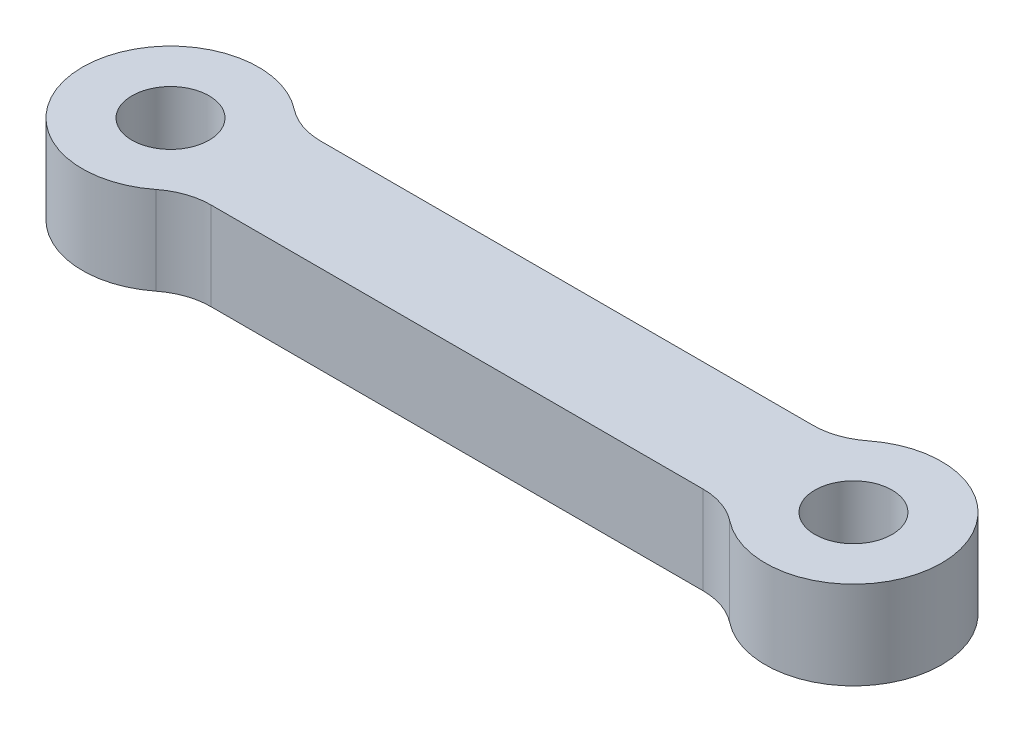
ISO-10303-21;
HEADER;
FILE_DESCRIPTION(('STEP AP214'),'2;1');
FILE_NAME('part.step','',(''),(''),'','','');
FILE_SCHEMA(('AUTOMOTIVE_DESIGN { 1 0 10303 214 1 1 1 1 }'));
ENDSEC;
DATA;
#1=APPLICATION_CONTEXT('core data for automotive mechanical design processes');
#2=APPLICATION_PROTOCOL_DEFINITION('international standard','automotive_design',2000,#1);
#3=PRODUCT_CONTEXT('',#1,'mechanical');
#4=PRODUCT('Part','Part','',(#3));
#5=PRODUCT_RELATED_PRODUCT_CATEGORY('part','',(#4));
#6=PRODUCT_DEFINITION_FORMATION('','',#4);
#7=PRODUCT_DEFINITION_CONTEXT('part definition',#1,'design');
#8=PRODUCT_DEFINITION('design','',#6,#7);
#9=PRODUCT_DEFINITION_SHAPE('','',#8);
#10=(LENGTH_UNIT() NAMED_UNIT(*) SI_UNIT(.MILLI.,.METRE.));
#11=(NAMED_UNIT(*) PLANE_ANGLE_UNIT() SI_UNIT($,.RADIAN.));
#12=(NAMED_UNIT(*) SI_UNIT($,.STERADIAN.) SOLID_ANGLE_UNIT());
#13=UNCERTAINTY_MEASURE_WITH_UNIT(LENGTH_MEASURE(1.E-05),#10,'distance_accuracy_value','');
#14=(GEOMETRIC_REPRESENTATION_CONTEXT(3) GLOBAL_UNCERTAINTY_ASSIGNED_CONTEXT((#13)) GLOBAL_UNIT_ASSIGNED_CONTEXT((#10,
#11,#12)) REPRESENTATION_CONTEXT('',''));
#15=CARTESIAN_POINT('',(0.,0.,0.));
#16=DIRECTION('',(0.,0.,1.));
#17=DIRECTION('',(1.,0.,0.));
#18=AXIS2_PLACEMENT_3D('',#15,#16,#17);
#19=CARTESIAN_POINT('',(0.,4.,0.));
#20=DIRECTION('',(0.,1.,0.));
#21=DIRECTION('',(0.,0.,1.));
#22=AXIS2_PLACEMENT_3D('',#19,#20,#21);
#23=PLANE('',#22);
#24=CARTESIAN_POINT('',(0.,4.,0.));
#25=DIRECTION('',(0.,1.,0.));
#26=DIRECTION('',(0.,0.,1.));
#27=AXIS2_PLACEMENT_3D('',#24,#25,#26);
#28=CIRCLE('',#27,1.75);
#29=CARTESIAN_POINT('',(0.,4.,1.75));
#30=VERTEX_POINT('',#29);
#31=EDGE_CURVE('E174',#30,#30,#28,.T.);
#32=ORIENTED_EDGE('',*,*,#31,.F.);
#33=EDGE_LOOP('',(#32));
#34=FACE_BOUND('',#33,.T.);
#35=DIRECTION('',(-1.,0.,0.));
#36=VECTOR('',#35,1.);
#37=CARTESIAN_POINT('',(27.8775010008008,4.,-2.5));
#38=LINE('',#37,#36);
#39=CARTESIAN_POINT('',(26.6698729810778,4.,-2.5));
#40=VERTEX_POINT('',#39);
#41=CARTESIAN_POINT('',(4.3301270189222,4.,-2.5));
#42=VERTEX_POINT('',#41);
#43=EDGE_CURVE('E127',#40,#42,#38,.T.);
#44=ORIENTED_EDGE('',*,*,#43,.T.);
#45=CARTESIAN_POINT('',(4.3301270189222,4.,-5.5));
#46=DIRECTION('',(0.,1.,0.));
#47=DIRECTION('',(0.,0.,1.));
#48=AXIS2_PLACEMENT_3D('',#45,#46,#47);
#49=CIRCLE('',#48,3.);
#50=CARTESIAN_POINT('',(2.47435829652697,4.,-3.14285714285714));
#51=VERTEX_POINT('',#50);
#52=EDGE_CURVE('E159',#42,#51,#49,.F.);
#53=ORIENTED_EDGE('',*,*,#52,.T.);
#54=CARTESIAN_POINT('',(0.,4.,0.));
#55=DIRECTION('',(0.,1.,0.));
#56=DIRECTION('',(0.,0.,1.));
#57=AXIS2_PLACEMENT_3D('',#54,#55,#56);
#58=CIRCLE('',#57,4.);
#59=CARTESIAN_POINT('',(2.47435829652697,4.,3.14285714285714));
#60=VERTEX_POINT('',#59);
#61=EDGE_CURVE('E135',#51,#60,#58,.T.);
#62=ORIENTED_EDGE('',*,*,#61,.T.);
#63=CARTESIAN_POINT('',(4.3301270189222,4.,5.5));
#64=DIRECTION('',(0.,1.,0.));
#65=DIRECTION('',(0.,0.,1.));
#66=AXIS2_PLACEMENT_3D('',#63,#64,#65);
#67=CIRCLE('',#66,3.);
#68=CARTESIAN_POINT('',(4.3301270189222,4.,2.5));
#69=VERTEX_POINT('',#68);
#70=EDGE_CURVE('E11',#60,#69,#67,.F.);
#71=ORIENTED_EDGE('',*,*,#70,.T.);
#72=DIRECTION('',(1.,0.,0.));
#73=VECTOR('',#72,1.);
#74=CARTESIAN_POINT('',(27.8775010008008,4.,2.5));
#75=LINE('',#74,#73);
#76=CARTESIAN_POINT('',(26.6698729810778,4.,2.5));
#77=VERTEX_POINT('',#76);
#78=EDGE_CURVE('E138',#69,#77,#75,.T.);
#79=ORIENTED_EDGE('',*,*,#78,.T.);
#80=CARTESIAN_POINT('',(26.6698729810778,4.,5.5));
#81=DIRECTION('',(0.,1.,0.));
#82=DIRECTION('',(0.,0.,1.));
#83=AXIS2_PLACEMENT_3D('',#80,#81,#82);
#84=CIRCLE('',#83,3.);
#85=CARTESIAN_POINT('',(28.525641703473,4.,3.14285714285714));
#86=VERTEX_POINT('',#85);
#87=EDGE_CURVE('E163',#77,#86,#84,.F.);
#88=ORIENTED_EDGE('',*,*,#87,.T.);
#89=CARTESIAN_POINT('',(31.,4.,0.));
#90=DIRECTION('',(0.,1.,0.));
#91=DIRECTION('',(0.,0.,1.));
#92=AXIS2_PLACEMENT_3D('',#89,#90,#91);
#93=CIRCLE('',#92,4.);
#94=CARTESIAN_POINT('',(28.525641703473,4.,-3.14285714285714));
#95=VERTEX_POINT('',#94);
#96=EDGE_CURVE('E178',#86,#95,#93,.T.);
#97=ORIENTED_EDGE('',*,*,#96,.T.);
#98=CARTESIAN_POINT('',(26.6698729810778,4.,-5.5));
#99=DIRECTION('',(0.,1.,0.));
#100=DIRECTION('',(0.,0.,1.));
#101=AXIS2_PLACEMENT_3D('',#98,#99,#100);
#102=CIRCLE('',#101,3.);
#103=EDGE_CURVE('E118',#95,#40,#102,.F.);
#104=ORIENTED_EDGE('',*,*,#103,.T.);
#105=EDGE_LOOP('',(#44,#53,#62,#71,#79,#88,#97,#104));
#106=FACE_BOUND('',#105,.T.);
#107=CARTESIAN_POINT('',(31.,4.,0.));
#108=DIRECTION('',(0.,1.,0.));
#109=DIRECTION('',(0.,0.,1.));
#110=AXIS2_PLACEMENT_3D('',#107,#108,#109);
#111=CIRCLE('',#110,1.75);
#112=CARTESIAN_POINT('',(31.,4.,1.75));
#113=VERTEX_POINT('',#112);
#114=EDGE_CURVE('E285',#113,#113,#111,.T.);
#115=ORIENTED_EDGE('',*,*,#114,.F.);
#116=EDGE_LOOP('',(#115));
#117=FACE_BOUND('',#116,.T.);
#118=ADVANCED_FACE('F43',(#34,#106,#117),#23,.T.);
#119=CARTESIAN_POINT('',(0.,0.,0.));
#120=DIRECTION('',(0.,1.,0.));
#121=DIRECTION('',(0.,0.,1.));
#122=AXIS2_PLACEMENT_3D('',#119,#120,#121);
#123=PLANE('',#122);
#124=CARTESIAN_POINT('',(0.,0.,0.));
#125=DIRECTION('',(0.,1.,0.));
#126=DIRECTION('',(0.,0.,1.));
#127=AXIS2_PLACEMENT_3D('',#124,#125,#126);
#128=CIRCLE('',#127,4.);
#129=CARTESIAN_POINT('',(2.47435829652697,0.,-3.14285714285714));
#130=VERTEX_POINT('',#129);
#131=CARTESIAN_POINT('',(2.47435829652697,0.,3.14285714285714));
#132=VERTEX_POINT('',#131);
#133=EDGE_CURVE('E166',#130,#132,#128,.T.);
#134=ORIENTED_EDGE('',*,*,#133,.F.);
#135=CARTESIAN_POINT('',(4.3301270189222,0.,-5.5));
#136=DIRECTION('',(0.,1.,0.));
#137=DIRECTION('',(0.,0.,1.));
#138=AXIS2_PLACEMENT_3D('',#135,#136,#137);
#139=CIRCLE('',#138,3.);
#140=CARTESIAN_POINT('',(4.3301270189222,0.,-2.5));
#141=VERTEX_POINT('',#140);
#142=EDGE_CURVE('E134',#130,#141,#139,.T.);
#143=ORIENTED_EDGE('',*,*,#142,.T.);
#144=DIRECTION('',(-1.,0.,0.));
#145=VECTOR('',#144,1.);
#146=CARTESIAN_POINT('',(27.8775010008008,0.,-2.5));
#147=LINE('',#146,#145);
#148=CARTESIAN_POINT('',(26.6698729810778,0.,-2.5));
#149=VERTEX_POINT('',#148);
#150=EDGE_CURVE('E124',#149,#141,#147,.T.);
#151=ORIENTED_EDGE('',*,*,#150,.F.);
#152=CARTESIAN_POINT('',(26.6698729810778,0.,-5.5));
#153=DIRECTION('',(0.,1.,0.));
#154=DIRECTION('',(0.,0.,1.));
#155=AXIS2_PLACEMENT_3D('',#152,#153,#154);
#156=CIRCLE('',#155,3.);
#157=CARTESIAN_POINT('',(28.525641703473,0.,-3.14285714285714));
#158=VERTEX_POINT('',#157);
#159=EDGE_CURVE('E108',#149,#158,#156,.T.);
#160=ORIENTED_EDGE('',*,*,#159,.T.);
#161=CARTESIAN_POINT('',(31.,0.,0.));
#162=DIRECTION('',(0.,1.,0.));
#163=DIRECTION('',(0.,0.,1.));
#164=AXIS2_PLACEMENT_3D('',#161,#162,#163);
#165=CIRCLE('',#164,4.);
#166=CARTESIAN_POINT('',(28.525641703473,0.,3.14285714285714));
#167=VERTEX_POINT('',#166);
#168=EDGE_CURVE('E136',#167,#158,#165,.T.);
#169=ORIENTED_EDGE('',*,*,#168,.F.);
#170=CARTESIAN_POINT('',(26.6698729810778,0.,5.5));
#171=DIRECTION('',(0.,1.,0.));
#172=DIRECTION('',(0.,0.,1.));
#173=AXIS2_PLACEMENT_3D('',#170,#171,#172);
#174=CIRCLE('',#173,3.);
#175=CARTESIAN_POINT('',(26.6698729810778,0.,2.5));
#176=VERTEX_POINT('',#175);
#177=EDGE_CURVE('E161',#167,#176,#174,.T.);
#178=ORIENTED_EDGE('',*,*,#177,.T.);
#179=DIRECTION('',(1.,0.,0.));
#180=VECTOR('',#179,1.);
#181=CARTESIAN_POINT('',(27.8775010008008,0.,2.5));
#182=LINE('',#181,#180);
#183=CARTESIAN_POINT('',(4.3301270189222,0.,2.5));
#184=VERTEX_POINT('',#183);
#185=EDGE_CURVE('E140',#184,#176,#182,.T.);
#186=ORIENTED_EDGE('',*,*,#185,.F.);
#187=CARTESIAN_POINT('',(4.3301270189222,0.,5.5));
#188=DIRECTION('',(0.,1.,0.));
#189=DIRECTION('',(0.,0.,1.));
#190=AXIS2_PLACEMENT_3D('',#187,#188,#189);
#191=CIRCLE('',#190,3.);
#192=EDGE_CURVE('E51',#184,#132,#191,.T.);
#193=ORIENTED_EDGE('',*,*,#192,.T.);
#194=EDGE_LOOP('',(#134,#143,#151,#160,#169,#178,#186,#193));
#195=FACE_BOUND('',#194,.T.);
#196=CARTESIAN_POINT('',(0.,0.,0.));
#197=DIRECTION('',(0.,1.,0.));
#198=DIRECTION('',(0.,0.,1.));
#199=AXIS2_PLACEMENT_3D('',#196,#197,#198);
#200=CIRCLE('',#199,1.75);
#201=CARTESIAN_POINT('',(0.,0.,1.75));
#202=VERTEX_POINT('',#201);
#203=EDGE_CURVE('E284',#202,#202,#200,.T.);
#204=ORIENTED_EDGE('',*,*,#203,.T.);
#205=EDGE_LOOP('',(#204));
#206=FACE_BOUND('',#205,.T.);
#207=CARTESIAN_POINT('',(31.,0.,0.));
#208=DIRECTION('',(0.,1.,0.));
#209=DIRECTION('',(0.,0.,1.));
#210=AXIS2_PLACEMENT_3D('',#207,#208,#209);
#211=CIRCLE('',#210,1.75);
#212=CARTESIAN_POINT('',(31.,0.,1.75));
#213=VERTEX_POINT('',#212);
#214=EDGE_CURVE('E288',#213,#213,#211,.T.);
#215=ORIENTED_EDGE('',*,*,#214,.T.);
#216=EDGE_LOOP('',(#215));
#217=FACE_BOUND('',#216,.T.);
#218=ADVANCED_FACE('F132',(#195,#206,#217),#123,.F.);
#219=CARTESIAN_POINT('',(0.,4.,0.));
#220=DIRECTION('',(0.,-1.,0.));
#221=DIRECTION('',(0.,0.,-1.));
#222=AXIS2_PLACEMENT_3D('',#219,#220,#221);
#223=CYLINDRICAL_SURFACE('',#222,4.);
#224=ORIENTED_EDGE('',*,*,#61,.F.);
#225=DIRECTION('',(0.,-1.,0.));
#226=VECTOR('',#225,1.);
#227=CARTESIAN_POINT('',(2.47435829652697,4.,-3.14285714285714));
#228=LINE('',#227,#226);
#229=EDGE_CURVE('E150',#51,#130,#228,.T.);
#230=ORIENTED_EDGE('',*,*,#229,.T.);
#231=ORIENTED_EDGE('',*,*,#133,.T.);
#232=DIRECTION('',(0.,-1.,0.));
#233=VECTOR('',#232,1.);
#234=CARTESIAN_POINT('',(2.47435829652697,4.,3.14285714285714));
#235=LINE('',#234,#233);
#236=EDGE_CURVE('E148',#132,#60,#235,.F.);
#237=ORIENTED_EDGE('',*,*,#236,.T.);
#238=EDGE_LOOP('',(#224,#230,#231,#237));
#239=FACE_BOUND('',#238,.T.);
#240=ADVANCED_FACE('F172',(#239),#223,.T.);
#241=CARTESIAN_POINT('',(27.8775010008008,4.,2.5));
#242=DIRECTION('',(0.,0.,-1.));
#243=DIRECTION('',(-1.,0.,0.));
#244=AXIS2_PLACEMENT_3D('',#241,#242,#243);
#245=PLANE('',#244);
#246=ORIENTED_EDGE('',*,*,#185,.T.);
#247=DIRECTION('',(0.,1.,0.));
#248=VECTOR('',#247,1.);
#249=CARTESIAN_POINT('',(26.6698729810778,4.,2.5));
#250=LINE('',#249,#248);
#251=EDGE_CURVE('E58',#176,#77,#250,.T.);
#252=ORIENTED_EDGE('',*,*,#251,.T.);
#253=ORIENTED_EDGE('',*,*,#78,.F.);
#254=DIRECTION('',(0.,1.,0.));
#255=VECTOR('',#254,1.);
#256=CARTESIAN_POINT('',(4.3301270189222,0.,2.5));
#257=LINE('',#256,#255);
#258=EDGE_CURVE('E153',#69,#184,#257,.F.);
#259=ORIENTED_EDGE('',*,*,#258,.T.);
#260=EDGE_LOOP('',(#246,#252,#253,#259));
#261=FACE_BOUND('',#260,.T.);
#262=ADVANCED_FACE('F176',(#261),#245,.F.);
#263=CARTESIAN_POINT('',(31.,4.,0.));
#264=DIRECTION('',(0.,-1.,0.));
#265=DIRECTION('',(0.,0.,-1.));
#266=AXIS2_PLACEMENT_3D('',#263,#264,#265);
#267=CYLINDRICAL_SURFACE('',#266,4.);
#268=ORIENTED_EDGE('',*,*,#168,.T.);
#269=DIRECTION('',(0.,-1.,0.));
#270=VECTOR('',#269,1.);
#271=CARTESIAN_POINT('',(28.525641703473,4.,-3.14285714285714));
#272=LINE('',#271,#270);
#273=EDGE_CURVE('E113',#158,#95,#272,.F.);
#274=ORIENTED_EDGE('',*,*,#273,.T.);
#275=ORIENTED_EDGE('',*,*,#96,.F.);
#276=DIRECTION('',(0.,-1.,0.));
#277=VECTOR('',#276,1.);
#278=CARTESIAN_POINT('',(28.525641703473,4.,3.14285714285714));
#279=LINE('',#278,#277);
#280=EDGE_CURVE('E128',#86,#167,#279,.T.);
#281=ORIENTED_EDGE('',*,*,#280,.T.);
#282=EDGE_LOOP('',(#268,#274,#275,#281));
#283=FACE_BOUND('',#282,.T.);
#284=ADVANCED_FACE('F213',(#283),#267,.T.);
#285=CARTESIAN_POINT('',(27.8775010008008,4.,-2.5));
#286=DIRECTION('',(0.,0.,1.));
#287=DIRECTION('',(1.,0.,0.));
#288=AXIS2_PLACEMENT_3D('',#285,#286,#287);
#289=PLANE('',#288);
#290=ORIENTED_EDGE('',*,*,#43,.F.);
#291=DIRECTION('',(0.,1.,0.));
#292=VECTOR('',#291,1.);
#293=CARTESIAN_POINT('',(26.6698729810778,0.,-2.5));
#294=LINE('',#293,#292);
#295=EDGE_CURVE('E112',#40,#149,#294,.F.);
#296=ORIENTED_EDGE('',*,*,#295,.T.);
#297=ORIENTED_EDGE('',*,*,#150,.T.);
#298=DIRECTION('',(0.,1.,0.));
#299=VECTOR('',#298,1.);
#300=CARTESIAN_POINT('',(4.3301270189222,4.,-2.5));
#301=LINE('',#300,#299);
#302=EDGE_CURVE('E129',#141,#42,#301,.T.);
#303=ORIENTED_EDGE('',*,*,#302,.T.);
#304=EDGE_LOOP('',(#290,#296,#297,#303));
#305=FACE_BOUND('',#304,.T.);
#306=ADVANCED_FACE('F123',(#305),#289,.F.);
#307=CARTESIAN_POINT('',(0.,4.,0.));
#308=DIRECTION('',(0.,-1.,0.));
#309=DIRECTION('',(0.,0.,-1.));
#310=AXIS2_PLACEMENT_3D('',#307,#308,#309);
#311=CYLINDRICAL_SURFACE('',#310,1.75);
#312=ORIENTED_EDGE('',*,*,#31,.T.);
#313=EDGE_LOOP('',(#312));
#314=FACE_BOUND('',#313,.T.);
#315=ORIENTED_EDGE('',*,*,#203,.F.);
#316=EDGE_LOOP('',(#315));
#317=FACE_BOUND('',#316,.T.);
#318=ADVANCED_FACE('F208',(#314,#317),#311,.F.);
#319=CARTESIAN_POINT('',(31.,4.,0.));
#320=DIRECTION('',(0.,-1.,0.));
#321=DIRECTION('',(0.,0.,-1.));
#322=AXIS2_PLACEMENT_3D('',#319,#320,#321);
#323=CYLINDRICAL_SURFACE('',#322,1.75);
#324=ORIENTED_EDGE('',*,*,#114,.T.);
#325=EDGE_LOOP('',(#324));
#326=FACE_BOUND('',#325,.T.);
#327=ORIENTED_EDGE('',*,*,#214,.F.);
#328=EDGE_LOOP('',(#327));
#329=FACE_BOUND('',#328,.T.);
#330=ADVANCED_FACE('F196',(#326,#329),#323,.F.);
#331=CARTESIAN_POINT('',(26.6698729810778,4.,-5.5));
#332=DIRECTION('',(0.,-1.,0.));
#333=DIRECTION('',(0.,0.,-1.));
#334=AXIS2_PLACEMENT_3D('',#331,#332,#333);
#335=CYLINDRICAL_SURFACE('',#334,3.);
#336=ORIENTED_EDGE('',*,*,#103,.F.);
#337=ORIENTED_EDGE('',*,*,#273,.F.);
#338=ORIENTED_EDGE('',*,*,#159,.F.);
#339=ORIENTED_EDGE('',*,*,#295,.F.);
#340=EDGE_LOOP('',(#336,#337,#338,#339));
#341=FACE_BOUND('',#340,.T.);
#342=ADVANCED_FACE('F111',(#341),#335,.F.);
#343=CARTESIAN_POINT('',(4.3301270189222,4.,-5.5));
#344=DIRECTION('',(0.,-1.,0.));
#345=DIRECTION('',(0.,0.,-1.));
#346=AXIS2_PLACEMENT_3D('',#343,#344,#345);
#347=CYLINDRICAL_SURFACE('',#346,3.);
#348=ORIENTED_EDGE('',*,*,#52,.F.);
#349=ORIENTED_EDGE('',*,*,#302,.F.);
#350=ORIENTED_EDGE('',*,*,#142,.F.);
#351=ORIENTED_EDGE('',*,*,#229,.F.);
#352=EDGE_LOOP('',(#348,#349,#350,#351));
#353=FACE_BOUND('',#352,.T.);
#354=ADVANCED_FACE('F187',(#353),#347,.F.);
#355=CARTESIAN_POINT('',(26.6698729810778,4.,5.5));
#356=DIRECTION('',(0.,-1.,0.));
#357=DIRECTION('',(0.,0.,-1.));
#358=AXIS2_PLACEMENT_3D('',#355,#356,#357);
#359=CYLINDRICAL_SURFACE('',#358,3.);
#360=ORIENTED_EDGE('',*,*,#87,.F.);
#361=ORIENTED_EDGE('',*,*,#251,.F.);
#362=ORIENTED_EDGE('',*,*,#177,.F.);
#363=ORIENTED_EDGE('',*,*,#280,.F.);
#364=EDGE_LOOP('',(#360,#361,#362,#363));
#365=FACE_BOUND('',#364,.T.);
#366=ADVANCED_FACE('F189',(#365),#359,.F.);
#367=CARTESIAN_POINT('',(4.3301270189222,4.,5.5));
#368=DIRECTION('',(0.,-1.,0.));
#369=DIRECTION('',(0.,0.,-1.));
#370=AXIS2_PLACEMENT_3D('',#367,#368,#369);
#371=CYLINDRICAL_SURFACE('',#370,3.);
#372=ORIENTED_EDGE('',*,*,#70,.F.);
#373=ORIENTED_EDGE('',*,*,#236,.F.);
#374=ORIENTED_EDGE('',*,*,#192,.F.);
#375=ORIENTED_EDGE('',*,*,#258,.F.);
#376=EDGE_LOOP('',(#372,#373,#374,#375));
#377=FACE_BOUND('',#376,.T.);
#378=ADVANCED_FACE('F45',(#377),#371,.F.);
#379=CLOSED_SHELL('',(#118,#218,#240,#262,#284,#306,#318,#330,#342,#354,#366,#378));
#380=MANIFOLD_SOLID_BREP('B2',#379);
#381=ADVANCED_BREP_SHAPE_REPRESENTATION('',(#18,#380),#14);
#382=SHAPE_DEFINITION_REPRESENTATION(#9,#381);
ENDSEC;
END-ISO-10303-21;
